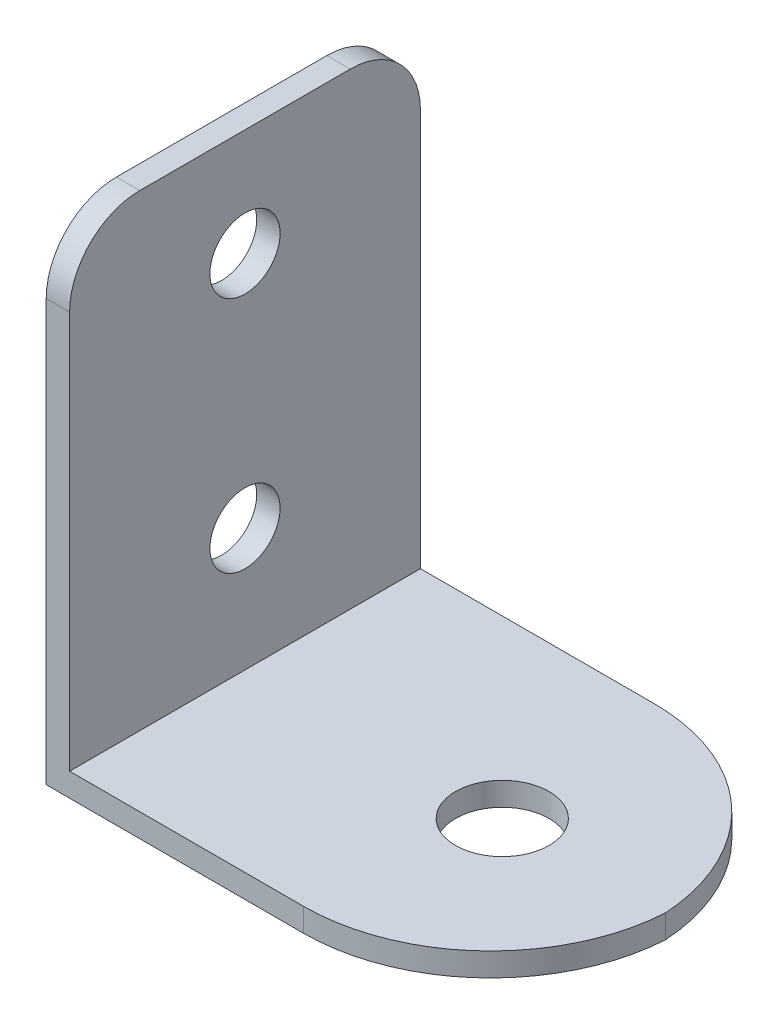
ISO-10303-21;
HEADER;
FILE_DESCRIPTION(('STEP AP214'),'2;1');
FILE_NAME('part.step','',(''),(''),'','','');
FILE_SCHEMA(('AUTOMOTIVE_DESIGN { 1 0 10303 214 1 1 1 1 }'));
ENDSEC;
DATA;
#1=APPLICATION_CONTEXT('core data for automotive mechanical design processes');
#2=APPLICATION_PROTOCOL_DEFINITION('international standard','automotive_design',2000,#1);
#3=PRODUCT_CONTEXT('',#1,'mechanical');
#4=PRODUCT('Part','Part','',(#3));
#5=PRODUCT_RELATED_PRODUCT_CATEGORY('part','',(#4));
#6=PRODUCT_DEFINITION_FORMATION('','',#4);
#7=PRODUCT_DEFINITION_CONTEXT('part definition',#1,'design');
#8=PRODUCT_DEFINITION('design','',#6,#7);
#9=PRODUCT_DEFINITION_SHAPE('','',#8);
#10=(LENGTH_UNIT() NAMED_UNIT(*) SI_UNIT(.MILLI.,.METRE.));
#11=(NAMED_UNIT(*) PLANE_ANGLE_UNIT() SI_UNIT($,.RADIAN.));
#12=(NAMED_UNIT(*) SI_UNIT($,.STERADIAN.) SOLID_ANGLE_UNIT());
#13=UNCERTAINTY_MEASURE_WITH_UNIT(LENGTH_MEASURE(1.E-05),#10,'distance_accuracy_value','');
#14=(GEOMETRIC_REPRESENTATION_CONTEXT(3) GLOBAL_UNCERTAINTY_ASSIGNED_CONTEXT((#13)) GLOBAL_UNIT_ASSIGNED_CONTEXT((#10,
#11,#12)) REPRESENTATION_CONTEXT('',''));
#15=CARTESIAN_POINT('',(0.,0.,0.));
#16=DIRECTION('',(0.,0.,1.));
#17=DIRECTION('',(1.,0.,0.));
#18=AXIS2_PLACEMENT_3D('',#15,#16,#17);
#19=CARTESIAN_POINT('',(0.,-1.,15.));
#20=DIRECTION('',(0.,1.,0.));
#21=DIRECTION('',(0.,0.,1.));
#22=AXIS2_PLACEMENT_3D('',#19,#20,#21);
#23=PLANE('',#22);
#24=CARTESIAN_POINT('',(11.,-1.,7.5));
#25=DIRECTION('',(0.,1.,0.));
#26=DIRECTION('',(0.,0.,1.));
#27=AXIS2_PLACEMENT_3D('',#24,#25,#26);
#28=CIRCLE('',#27,2.);
#29=CARTESIAN_POINT('',(11.,-1.,9.5));
#30=VERTEX_POINT('',#29);
#31=EDGE_CURVE('E259',#30,#30,#28,.T.);
#32=ORIENTED_EDGE('',*,*,#31,.T.);
#33=EDGE_LOOP('',(#32));
#34=FACE_BOUND('',#33,.T.);
#35=DIRECTION('',(1.,0.,0.));
#36=VECTOR('',#35,1.);
#37=CARTESIAN_POINT('',(0.,-1.,0.));
#38=LINE('',#37,#36);
#39=CARTESIAN_POINT('',(-1.,-1.,0.));
#40=VERTEX_POINT('',#39);
#41=CARTESIAN_POINT('',(10.,-1.,0.));
#42=VERTEX_POINT('',#41);
#43=EDGE_CURVE('E140',#40,#42,#38,.T.);
#44=ORIENTED_EDGE('',*,*,#43,.T.);
#45=CARTESIAN_POINT('',(10.,-1.,8.));
#46=DIRECTION('',(0.,1.,0.));
#47=DIRECTION('',(0.,0.,1.));
#48=AXIS2_PLACEMENT_3D('',#45,#46,#47);
#49=CIRCLE('',#48,8.);
#50=CARTESIAN_POINT('',(17.9843597113357,-1.,7.5));
#51=VERTEX_POINT('',#50);
#52=EDGE_CURVE('E158',#42,#51,#49,.F.);
#53=ORIENTED_EDGE('',*,*,#52,.T.);
#54=CARTESIAN_POINT('',(10.,-1.,7.));
#55=DIRECTION('',(0.,1.,0.));
#56=DIRECTION('',(0.,0.,1.));
#57=AXIS2_PLACEMENT_3D('',#54,#55,#56);
#58=CIRCLE('',#57,8.);
#59=CARTESIAN_POINT('',(10.,-1.,15.));
#60=VERTEX_POINT('',#59);
#61=EDGE_CURVE('E156',#51,#60,#58,.F.);
#62=ORIENTED_EDGE('',*,*,#61,.T.);
#63=DIRECTION('',(1.,0.,0.));
#64=VECTOR('',#63,1.);
#65=CARTESIAN_POINT('',(0.,-1.,15.));
#66=LINE('',#65,#64);
#67=CARTESIAN_POINT('',(-1.,-1.,15.));
#68=VERTEX_POINT('',#67);
#69=EDGE_CURVE('E132',#68,#60,#66,.T.);
#70=ORIENTED_EDGE('',*,*,#69,.F.);
#71=DIRECTION('',(0.,0.,-1.));
#72=VECTOR('',#71,1.);
#73=CARTESIAN_POINT('',(-1.,-1.,15.));
#74=LINE('',#73,#72);
#75=EDGE_CURVE('E139',#68,#40,#74,.T.);
#76=ORIENTED_EDGE('',*,*,#75,.T.);
#77=EDGE_LOOP('',(#44,#53,#62,#70,#76));
#78=FACE_BOUND('',#77,.T.);
#79=ADVANCED_FACE('F35',(#34,#78),#23,.F.);
#80=CARTESIAN_POINT('',(0.,0.,15.));
#81=DIRECTION('',(0.,1.,0.));
#82=DIRECTION('',(0.,0.,1.));
#83=AXIS2_PLACEMENT_3D('',#80,#81,#82);
#84=PLANE('',#83);
#85=CARTESIAN_POINT('',(11.,0.,7.5));
#86=DIRECTION('',(0.,1.,0.));
#87=DIRECTION('',(0.,0.,1.));
#88=AXIS2_PLACEMENT_3D('',#85,#86,#87);
#89=CIRCLE('',#88,2.);
#90=CARTESIAN_POINT('',(11.,0.,9.5));
#91=VERTEX_POINT('',#90);
#92=EDGE_CURVE('E260',#91,#91,#89,.T.);
#93=ORIENTED_EDGE('',*,*,#92,.F.);
#94=EDGE_LOOP('',(#93));
#95=FACE_BOUND('',#94,.T.);
#96=CARTESIAN_POINT('',(10.,0.,7.));
#97=DIRECTION('',(0.,1.,0.));
#98=DIRECTION('',(0.,0.,1.));
#99=AXIS2_PLACEMENT_3D('',#96,#97,#98);
#100=CIRCLE('',#99,8.);
#101=CARTESIAN_POINT('',(10.,0.,15.));
#102=VERTEX_POINT('',#101);
#103=CARTESIAN_POINT('',(17.9843597113357,0.,7.5));
#104=VERTEX_POINT('',#103);
#105=EDGE_CURVE('E160',#102,#104,#100,.T.);
#106=ORIENTED_EDGE('',*,*,#105,.T.);
#107=CARTESIAN_POINT('',(10.,0.,8.));
#108=DIRECTION('',(0.,1.,0.));
#109=DIRECTION('',(0.,0.,1.));
#110=AXIS2_PLACEMENT_3D('',#107,#108,#109);
#111=CIRCLE('',#110,8.);
#112=CARTESIAN_POINT('',(10.,0.,0.));
#113=VERTEX_POINT('',#112);
#114=EDGE_CURVE('E162',#104,#113,#111,.T.);
#115=ORIENTED_EDGE('',*,*,#114,.T.);
#116=DIRECTION('',(1.,0.,0.));
#117=VECTOR('',#116,1.);
#118=CARTESIAN_POINT('',(0.,0.,0.));
#119=LINE('',#118,#117);
#120=CARTESIAN_POINT('',(0.,0.,0.));
#121=VERTEX_POINT('',#120);
#122=EDGE_CURVE('E124',#121,#113,#119,.T.);
#123=ORIENTED_EDGE('',*,*,#122,.F.);
#124=DIRECTION('',(0.,0.,-1.));
#125=VECTOR('',#124,1.);
#126=CARTESIAN_POINT('',(0.,0.,15.));
#127=LINE('',#126,#125);
#128=CARTESIAN_POINT('',(0.,0.,15.));
#129=VERTEX_POINT('',#128);
#130=EDGE_CURVE('E112',#129,#121,#127,.T.);
#131=ORIENTED_EDGE('',*,*,#130,.F.);
#132=DIRECTION('',(1.,0.,0.));
#133=VECTOR('',#132,1.);
#134=CARTESIAN_POINT('',(0.,0.,15.));
#135=LINE('',#134,#133);
#136=EDGE_CURVE('E117',#129,#102,#135,.T.);
#137=ORIENTED_EDGE('',*,*,#136,.T.);
#138=EDGE_LOOP('',(#106,#115,#123,#131,#137));
#139=FACE_BOUND('',#138,.T.);
#140=ADVANCED_FACE('F121',(#95,#139),#84,.T.);
#141=CARTESIAN_POINT('',(0.,0.,15.));
#142=DIRECTION('',(1.,0.,0.));
#143=DIRECTION('',(0.,0.,-1.));
#144=AXIS2_PLACEMENT_3D('',#141,#142,#143);
#145=PLANE('',#144);
#146=CARTESIAN_POINT('',(0.,15.4201327945316,7.5));
#147=DIRECTION('',(1.,0.,0.));
#148=DIRECTION('',(0.,0.,-1.));
#149=AXIS2_PLACEMENT_3D('',#146,#147,#148);
#150=CIRCLE('',#149,1.5);
#151=CARTESIAN_POINT('',(0.,15.4201327945316,6.));
#152=VERTEX_POINT('',#151);
#153=EDGE_CURVE('E247',#152,#152,#150,.T.);
#154=ORIENTED_EDGE('',*,*,#153,.F.);
#155=EDGE_LOOP('',(#154));
#156=FACE_BOUND('',#155,.T.);
#157=CARTESIAN_POINT('',(0.,5.24762784579025,7.5));
#158=DIRECTION('',(1.,0.,0.));
#159=DIRECTION('',(0.,0.,-1.));
#160=AXIS2_PLACEMENT_3D('',#157,#158,#159);
#161=CIRCLE('',#160,1.5);
#162=CARTESIAN_POINT('',(0.,5.24762784579025,6.));
#163=VERTEX_POINT('',#162);
#164=EDGE_CURVE('E168',#163,#163,#161,.T.);
#165=ORIENTED_EDGE('',*,*,#164,.F.);
#166=EDGE_LOOP('',(#165));
#167=FACE_BOUND('',#166,.T.);
#168=DIRECTION('',(0.,0.,-1.));
#169=VECTOR('',#168,1.);
#170=CARTESIAN_POINT('',(0.,20.,15.));
#171=LINE('',#170,#169);
#172=CARTESIAN_POINT('',(0.,20.,12.));
#173=VERTEX_POINT('',#172);
#174=CARTESIAN_POINT('',(0.,20.,3.));
#175=VERTEX_POINT('',#174);
#176=EDGE_CURVE('E126',#173,#175,#171,.T.);
#177=ORIENTED_EDGE('',*,*,#176,.F.);
#178=CARTESIAN_POINT('',(0.,17.,12.));
#179=DIRECTION('',(1.,0.,0.));
#180=DIRECTION('',(0.,0.,-1.));
#181=AXIS2_PLACEMENT_3D('',#178,#179,#180);
#182=CIRCLE('',#181,3.);
#183=CARTESIAN_POINT('',(0.,17.,15.));
#184=VERTEX_POINT('',#183);
#185=EDGE_CURVE('E114',#173,#184,#182,.T.);
#186=ORIENTED_EDGE('',*,*,#185,.T.);
#187=DIRECTION('',(0.,-1.,0.));
#188=VECTOR('',#187,1.);
#189=CARTESIAN_POINT('',(0.,0.,15.));
#190=LINE('',#189,#188);
#191=EDGE_CURVE('E107',#184,#129,#190,.T.);
#192=ORIENTED_EDGE('',*,*,#191,.T.);
#193=ORIENTED_EDGE('',*,*,#130,.T.);
#194=DIRECTION('',(0.,-1.,0.));
#195=VECTOR('',#194,1.);
#196=CARTESIAN_POINT('',(0.,0.,0.));
#197=LINE('',#196,#195);
#198=CARTESIAN_POINT('',(0.,17.,0.));
#199=VERTEX_POINT('',#198);
#200=EDGE_CURVE('E145',#199,#121,#197,.T.);
#201=ORIENTED_EDGE('',*,*,#200,.F.);
#202=CARTESIAN_POINT('',(0.,17.,3.));
#203=DIRECTION('',(1.,0.,0.));
#204=DIRECTION('',(0.,0.,-1.));
#205=AXIS2_PLACEMENT_3D('',#202,#203,#204);
#206=CIRCLE('',#205,3.);
#207=EDGE_CURVE('E173',#199,#175,#206,.T.);
#208=ORIENTED_EDGE('',*,*,#207,.T.);
#209=EDGE_LOOP('',(#177,#186,#192,#193,#201,#208));
#210=FACE_BOUND('',#209,.T.);
#211=ADVANCED_FACE('F110',(#156,#167,#210),#145,.T.);
#212=CARTESIAN_POINT('',(-1.,20.,15.));
#213=DIRECTION('',(0.,1.,0.));
#214=DIRECTION('',(0.,0.,1.));
#215=AXIS2_PLACEMENT_3D('',#212,#213,#214);
#216=PLANE('',#215);
#217=DIRECTION('',(0.,0.,-1.));
#218=VECTOR('',#217,1.);
#219=CARTESIAN_POINT('',(-1.,20.,15.));
#220=LINE('',#219,#218);
#221=CARTESIAN_POINT('',(-1.,20.,12.));
#222=VERTEX_POINT('',#221);
#223=CARTESIAN_POINT('',(-1.,20.,3.));
#224=VERTEX_POINT('',#223);
#225=EDGE_CURVE('E150',#222,#224,#220,.T.);
#226=ORIENTED_EDGE('',*,*,#225,.F.);
#227=DIRECTION('',(1.,0.,0.));
#228=VECTOR('',#227,1.);
#229=CARTESIAN_POINT('',(0.,20.,12.));
#230=LINE('',#229,#228);
#231=EDGE_CURVE('E170',#222,#173,#230,.T.);
#232=ORIENTED_EDGE('',*,*,#231,.T.);
#233=ORIENTED_EDGE('',*,*,#176,.T.);
#234=DIRECTION('',(1.,0.,0.));
#235=VECTOR('',#234,1.);
#236=CARTESIAN_POINT('',(-1.,20.,3.));
#237=LINE('',#236,#235);
#238=EDGE_CURVE('E165',#175,#224,#237,.F.);
#239=ORIENTED_EDGE('',*,*,#238,.T.);
#240=EDGE_LOOP('',(#226,#232,#233,#239));
#241=FACE_BOUND('',#240,.T.);
#242=ADVANCED_FACE('F184',(#241),#216,.T.);
#243=CARTESIAN_POINT('',(-1.,0.,15.));
#244=DIRECTION('',(1.,0.,0.));
#245=DIRECTION('',(0.,0.,-1.));
#246=AXIS2_PLACEMENT_3D('',#243,#244,#245);
#247=PLANE('',#246);
#248=CARTESIAN_POINT('',(-1.,15.4201327945316,7.5));
#249=DIRECTION('',(-1.,0.,0.));
#250=DIRECTION('',(0.,0.,1.));
#251=AXIS2_PLACEMENT_3D('',#248,#249,#250);
#252=CIRCLE('',#251,1.5);
#253=CARTESIAN_POINT('',(-1.,15.4201327945316,9.));
#254=VERTEX_POINT('',#253);
#255=EDGE_CURVE('E256',#254,#254,#252,.T.);
#256=ORIENTED_EDGE('',*,*,#255,.F.);
#257=EDGE_LOOP('',(#256));
#258=FACE_BOUND('',#257,.T.);
#259=CARTESIAN_POINT('',(-1.,5.24762784579025,7.5));
#260=DIRECTION('',(-1.,0.,0.));
#261=DIRECTION('',(0.,0.,1.));
#262=AXIS2_PLACEMENT_3D('',#259,#260,#261);
#263=CIRCLE('',#262,1.5);
#264=CARTESIAN_POINT('',(-1.,5.24762784579025,9.));
#265=VERTEX_POINT('',#264);
#266=EDGE_CURVE('E251',#265,#265,#263,.T.);
#267=ORIENTED_EDGE('',*,*,#266,.F.);
#268=EDGE_LOOP('',(#267));
#269=FACE_BOUND('',#268,.T.);
#270=DIRECTION('',(0.,1.,0.));
#271=VECTOR('',#270,1.);
#272=CARTESIAN_POINT('',(-1.,0.,15.));
#273=LINE('',#272,#271);
#274=CARTESIAN_POINT('',(-1.,17.,15.));
#275=VERTEX_POINT('',#274);
#276=EDGE_CURVE('E116',#275,#68,#273,.F.);
#277=ORIENTED_EDGE('',*,*,#276,.F.);
#278=CARTESIAN_POINT('',(-1.,17.,12.));
#279=DIRECTION('',(1.,0.,0.));
#280=DIRECTION('',(0.,0.,-1.));
#281=AXIS2_PLACEMENT_3D('',#278,#279,#280);
#282=CIRCLE('',#281,3.);
#283=EDGE_CURVE('E43',#275,#222,#282,.F.);
#284=ORIENTED_EDGE('',*,*,#283,.T.);
#285=ORIENTED_EDGE('',*,*,#225,.T.);
#286=CARTESIAN_POINT('',(-1.,17.,3.));
#287=DIRECTION('',(1.,0.,0.));
#288=DIRECTION('',(0.,0.,-1.));
#289=AXIS2_PLACEMENT_3D('',#286,#287,#288);
#290=CIRCLE('',#289,3.);
#291=CARTESIAN_POINT('',(-1.,17.,0.));
#292=VERTEX_POINT('',#291);
#293=EDGE_CURVE('E50',#224,#292,#290,.F.);
#294=ORIENTED_EDGE('',*,*,#293,.T.);
#295=DIRECTION('',(0.,1.,0.));
#296=VECTOR('',#295,1.);
#297=CARTESIAN_POINT('',(-1.,0.,0.));
#298=LINE('',#297,#296);
#299=EDGE_CURVE('E134',#292,#40,#298,.F.);
#300=ORIENTED_EDGE('',*,*,#299,.T.);
#301=ORIENTED_EDGE('',*,*,#75,.F.);
#302=EDGE_LOOP('',(#277,#284,#285,#294,#300,#301));
#303=FACE_BOUND('',#302,.T.);
#304=ADVANCED_FACE('F179',(#258,#269,#303),#247,.F.);
#305=CARTESIAN_POINT('',(0.,0.,15.));
#306=DIRECTION('',(0.,0.,-1.));
#307=DIRECTION('',(-1.,0.,0.));
#308=AXIS2_PLACEMENT_3D('',#305,#306,#307);
#309=PLANE('',#308);
#310=ORIENTED_EDGE('',*,*,#191,.F.);
#311=DIRECTION('',(1.,0.,0.));
#312=VECTOR('',#311,1.);
#313=CARTESIAN_POINT('',(-1.,17.,15.));
#314=LINE('',#313,#312);
#315=EDGE_CURVE('E58',#184,#275,#314,.F.);
#316=ORIENTED_EDGE('',*,*,#315,.T.);
#317=ORIENTED_EDGE('',*,*,#276,.T.);
#318=ORIENTED_EDGE('',*,*,#69,.T.);
#319=DIRECTION('',(0.,-1.,0.));
#320=VECTOR('',#319,1.);
#321=CARTESIAN_POINT('',(10.,0.,15.));
#322=LINE('',#321,#320);
#323=EDGE_CURVE('E131',#60,#102,#322,.F.);
#324=ORIENTED_EDGE('',*,*,#323,.T.);
#325=ORIENTED_EDGE('',*,*,#136,.F.);
#326=EDGE_LOOP('',(#310,#316,#317,#318,#324,#325));
#327=FACE_BOUND('',#326,.T.);
#328=ADVANCED_FACE('F128',(#327),#309,.F.);
#329=CARTESIAN_POINT('',(0.,0.,0.));
#330=DIRECTION('',(0.,0.,-1.));
#331=DIRECTION('',(-1.,0.,0.));
#332=AXIS2_PLACEMENT_3D('',#329,#330,#331);
#333=PLANE('',#332);
#334=ORIENTED_EDGE('',*,*,#299,.F.);
#335=DIRECTION('',(1.,0.,0.));
#336=VECTOR('',#335,1.);
#337=CARTESIAN_POINT('',(0.,17.,0.));
#338=LINE('',#337,#336);
#339=EDGE_CURVE('E11',#292,#199,#338,.T.);
#340=ORIENTED_EDGE('',*,*,#339,.T.);
#341=ORIENTED_EDGE('',*,*,#200,.T.);
#342=ORIENTED_EDGE('',*,*,#122,.T.);
#343=DIRECTION('',(0.,-1.,0.));
#344=VECTOR('',#343,1.);
#345=CARTESIAN_POINT('',(10.,0.,0.));
#346=LINE('',#345,#344);
#347=EDGE_CURVE('E125',#113,#42,#346,.T.);
#348=ORIENTED_EDGE('',*,*,#347,.T.);
#349=ORIENTED_EDGE('',*,*,#43,.F.);
#350=EDGE_LOOP('',(#334,#340,#341,#342,#348,#349));
#351=FACE_BOUND('',#350,.T.);
#352=ADVANCED_FACE('F216',(#351),#333,.T.);
#353=CARTESIAN_POINT('',(10.,0.,7.));
#354=DIRECTION('',(0.,1.,0.));
#355=DIRECTION('',(0.,0.,1.));
#356=AXIS2_PLACEMENT_3D('',#353,#354,#355);
#357=CYLINDRICAL_SURFACE('',#356,8.);
#358=DIRECTION('',(0.,1.,0.));
#359=VECTOR('',#358,1.);
#360=CARTESIAN_POINT('',(17.9843597113357,-0.5,7.5));
#361=LINE('',#360,#359);
#362=EDGE_CURVE('E143',#104,#51,#361,.F.);
#363=ORIENTED_EDGE('',*,*,#362,.F.);
#364=ORIENTED_EDGE('',*,*,#105,.F.);
#365=ORIENTED_EDGE('',*,*,#323,.F.);
#366=ORIENTED_EDGE('',*,*,#61,.F.);
#367=EDGE_LOOP('',(#363,#364,#365,#366));
#368=FACE_BOUND('',#367,.T.);
#369=ADVANCED_FACE('F213',(#368),#357,.T.);
#370=CARTESIAN_POINT('',(10.,0.,8.));
#371=DIRECTION('',(0.,-1.,0.));
#372=DIRECTION('',(0.,0.,-1.));
#373=AXIS2_PLACEMENT_3D('',#370,#371,#372);
#374=CYLINDRICAL_SURFACE('',#373,8.);
#375=ORIENTED_EDGE('',*,*,#114,.F.);
#376=ORIENTED_EDGE('',*,*,#362,.T.);
#377=ORIENTED_EDGE('',*,*,#52,.F.);
#378=ORIENTED_EDGE('',*,*,#347,.F.);
#379=EDGE_LOOP('',(#375,#376,#377,#378));
#380=FACE_BOUND('',#379,.T.);
#381=ADVANCED_FACE('F211',(#380),#374,.T.);
#382=CARTESIAN_POINT('',(17.9843597113357,5.24762784579025,7.5));
#383=DIRECTION('',(-1.,0.,0.));
#384=DIRECTION('',(0.,0.,1.));
#385=AXIS2_PLACEMENT_3D('',#382,#383,#384);
#386=CYLINDRICAL_SURFACE('',#385,1.5);
#387=ORIENTED_EDGE('',*,*,#164,.T.);
#388=EDGE_LOOP('',(#387));
#389=FACE_BOUND('',#388,.T.);
#390=ORIENTED_EDGE('',*,*,#266,.T.);
#391=EDGE_LOOP('',(#390));
#392=FACE_BOUND('',#391,.T.);
#393=ADVANCED_FACE('F195',(#389,#392),#386,.F.);
#394=CARTESIAN_POINT('',(17.9843597113357,15.4201327945316,7.5));
#395=DIRECTION('',(-1.,0.,0.));
#396=DIRECTION('',(0.,0.,1.));
#397=AXIS2_PLACEMENT_3D('',#394,#395,#396);
#398=CYLINDRICAL_SURFACE('',#397,1.5);
#399=ORIENTED_EDGE('',*,*,#153,.T.);
#400=EDGE_LOOP('',(#399));
#401=FACE_BOUND('',#400,.T.);
#402=ORIENTED_EDGE('',*,*,#255,.T.);
#403=EDGE_LOOP('',(#402));
#404=FACE_BOUND('',#403,.T.);
#405=ADVANCED_FACE('F188',(#401,#404),#398,.F.);
#406=CARTESIAN_POINT('',(-1.,17.,12.));
#407=DIRECTION('',(-1.,0.,0.));
#408=DIRECTION('',(0.,0.,1.));
#409=AXIS2_PLACEMENT_3D('',#406,#407,#408);
#410=CYLINDRICAL_SURFACE('',#409,3.);
#411=ORIENTED_EDGE('',*,*,#283,.F.);
#412=ORIENTED_EDGE('',*,*,#315,.F.);
#413=ORIENTED_EDGE('',*,*,#185,.F.);
#414=ORIENTED_EDGE('',*,*,#231,.F.);
#415=EDGE_LOOP('',(#411,#412,#413,#414));
#416=FACE_BOUND('',#415,.T.);
#417=ADVANCED_FACE('F186',(#416),#410,.T.);
#418=CARTESIAN_POINT('',(0.,17.,3.));
#419=DIRECTION('',(1.,0.,0.));
#420=DIRECTION('',(0.,0.,-1.));
#421=AXIS2_PLACEMENT_3D('',#418,#419,#420);
#422=CYLINDRICAL_SURFACE('',#421,3.);
#423=ORIENTED_EDGE('',*,*,#293,.F.);
#424=ORIENTED_EDGE('',*,*,#238,.F.);
#425=ORIENTED_EDGE('',*,*,#207,.F.);
#426=ORIENTED_EDGE('',*,*,#339,.F.);
#427=EDGE_LOOP('',(#423,#424,#425,#426));
#428=FACE_BOUND('',#427,.T.);
#429=ADVANCED_FACE('F37',(#428),#422,.T.);
#430=CARTESIAN_POINT('',(11.,-1.,7.5));
#431=DIRECTION('',(0.,1.,0.));
#432=DIRECTION('',(0.,0.,1.));
#433=AXIS2_PLACEMENT_3D('',#430,#431,#432);
#434=CYLINDRICAL_SURFACE('',#433,2.);
#435=ORIENTED_EDGE('',*,*,#31,.F.);
#436=EDGE_LOOP('',(#435));
#437=FACE_BOUND('',#436,.T.);
#438=ORIENTED_EDGE('',*,*,#92,.T.);
#439=EDGE_LOOP('',(#438));
#440=FACE_BOUND('',#439,.T.);
#441=ADVANCED_FACE('F193',(#437,#440),#434,.F.);
#442=CLOSED_SHELL('',(#79,#140,#211,#242,#304,#328,#352,#369,#381,#393,#405,#417,#429,#441));
#443=MANIFOLD_SOLID_BREP('B2',#442);
#444=ADVANCED_BREP_SHAPE_REPRESENTATION('',(#18,#443),#14);
#445=SHAPE_DEFINITION_REPRESENTATION(#9,#444);
ENDSEC;
END-ISO-10303-21;
